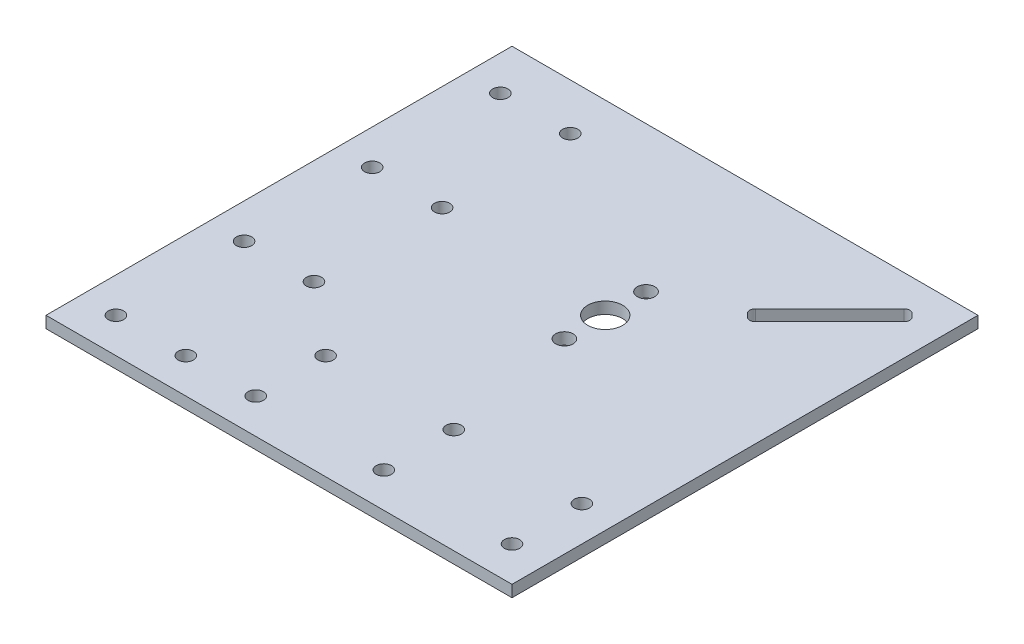
ISO-10303-21;
HEADER;
FILE_DESCRIPTION(('STEP AP214'),'2;1');
FILE_NAME('part.step','',(''),(''),'','','');
FILE_SCHEMA(('AUTOMOTIVE_DESIGN { 1 0 10303 214 1 1 1 1 }'));
ENDSEC;
DATA;
#1=APPLICATION_CONTEXT('core data for automotive mechanical design processes');
#2=APPLICATION_PROTOCOL_DEFINITION('international standard','automotive_design',2000,#1);
#3=PRODUCT_CONTEXT('',#1,'mechanical');
#4=PRODUCT('Part','Part','',(#3));
#5=PRODUCT_RELATED_PRODUCT_CATEGORY('part','',(#4));
#6=PRODUCT_DEFINITION_FORMATION('','',#4);
#7=PRODUCT_DEFINITION_CONTEXT('part definition',#1,'design');
#8=PRODUCT_DEFINITION('design','',#6,#7);
#9=PRODUCT_DEFINITION_SHAPE('','',#8);
#10=(LENGTH_UNIT() NAMED_UNIT(*) SI_UNIT(.MILLI.,.METRE.));
#11=(NAMED_UNIT(*) PLANE_ANGLE_UNIT() SI_UNIT($,.RADIAN.));
#12=(NAMED_UNIT(*) SI_UNIT($,.STERADIAN.) SOLID_ANGLE_UNIT());
#13=UNCERTAINTY_MEASURE_WITH_UNIT(LENGTH_MEASURE(1.E-05),#10,'distance_accuracy_value','');
#14=(GEOMETRIC_REPRESENTATION_CONTEXT(3) GLOBAL_UNCERTAINTY_ASSIGNED_CONTEXT((#13)) GLOBAL_UNIT_ASSIGNED_CONTEXT((#10,
#11,#12)) REPRESENTATION_CONTEXT('',''));
#15=CARTESIAN_POINT('',(0.,0.,0.));
#16=DIRECTION('',(0.,0.,1.));
#17=DIRECTION('',(1.,0.,0.));
#18=AXIS2_PLACEMENT_3D('',#15,#16,#17);
#19=CARTESIAN_POINT('',(95.25,6.35,-57.15));
#20=DIRECTION('',(0.,1.,0.));
#21=DIRECTION('',(0.,0.,1.));
#22=AXIS2_PLACEMENT_3D('',#19,#20,#21);
#23=CYLINDRICAL_SURFACE('',#22,4.16725100000001);
#24=CARTESIAN_POINT('',(95.25,0.,-57.15));
#25=DIRECTION('',(0.,1.,0.));
#26=DIRECTION('',(0.,0.,1.));
#27=AXIS2_PLACEMENT_3D('',#24,#25,#26);
#28=CIRCLE('',#27,4.16725100000001);
#29=CARTESIAN_POINT('',(95.25,0.,-52.982749));
#30=VERTEX_POINT('',#29);
#31=EDGE_CURVE('E216',#30,#30,#28,.T.);
#32=ORIENTED_EDGE('',*,*,#31,.F.);
#33=EDGE_LOOP('',(#32));
#34=FACE_BOUND('',#33,.T.);
#35=CARTESIAN_POINT('',(95.25,6.35,-57.15));
#36=DIRECTION('',(0.,1.,0.));
#37=DIRECTION('',(0.,0.,1.));
#38=AXIS2_PLACEMENT_3D('',#35,#36,#37);
#39=CIRCLE('',#38,4.16725100000001);
#40=CARTESIAN_POINT('',(95.25,6.35,-52.982749));
#41=VERTEX_POINT('',#40);
#42=EDGE_CURVE('E219',#41,#41,#39,.T.);
#43=ORIENTED_EDGE('',*,*,#42,.T.);
#44=EDGE_LOOP('',(#43));
#45=FACE_BOUND('',#44,.T.);
#46=ADVANCED_FACE('F41',(#34,#45),#23,.F.);
#47=CARTESIAN_POINT('',(95.25,6.35,-19.05));
#48=DIRECTION('',(0.,1.,0.));
#49=DIRECTION('',(0.,0.,1.));
#50=AXIS2_PLACEMENT_3D('',#47,#48,#49);
#51=CYLINDRICAL_SURFACE('',#50,4.16725100000001);
#52=CARTESIAN_POINT('',(95.25,0.,-19.05));
#53=DIRECTION('',(0.,1.,0.));
#54=DIRECTION('',(0.,0.,1.));
#55=AXIS2_PLACEMENT_3D('',#52,#53,#54);
#56=CIRCLE('',#55,4.16725100000001);
#57=CARTESIAN_POINT('',(95.25,0.,-14.882749));
#58=VERTEX_POINT('',#57);
#59=EDGE_CURVE('E210',#58,#58,#56,.T.);
#60=ORIENTED_EDGE('',*,*,#59,.F.);
#61=EDGE_LOOP('',(#60));
#62=FACE_BOUND('',#61,.T.);
#63=CARTESIAN_POINT('',(95.25,6.35,-19.05));
#64=DIRECTION('',(0.,1.,0.));
#65=DIRECTION('',(0.,0.,1.));
#66=AXIS2_PLACEMENT_3D('',#63,#64,#65);
#67=CIRCLE('',#66,4.16725100000001);
#68=CARTESIAN_POINT('',(95.25,6.35,-14.882749));
#69=VERTEX_POINT('',#68);
#70=EDGE_CURVE('E213',#69,#69,#67,.T.);
#71=ORIENTED_EDGE('',*,*,#70,.T.);
#72=EDGE_LOOP('',(#71));
#73=FACE_BOUND('',#72,.T.);
#74=ADVANCED_FACE('F358',(#62,#73),#51,.F.);
#75=CARTESIAN_POINT('',(165.1,6.35,-57.15));
#76=DIRECTION('',(0.,1.,0.));
#77=DIRECTION('',(0.,0.,1.));
#78=AXIS2_PLACEMENT_3D('',#75,#76,#77);
#79=CYLINDRICAL_SURFACE('',#78,4.16725100000001);
#80=CARTESIAN_POINT('',(165.1,0.,-57.15));
#81=DIRECTION('',(0.,1.,0.));
#82=DIRECTION('',(0.,0.,1.));
#83=AXIS2_PLACEMENT_3D('',#80,#81,#82);
#84=CIRCLE('',#83,4.16725100000001);
#85=CARTESIAN_POINT('',(165.1,0.,-52.982749));
#86=VERTEX_POINT('',#85);
#87=EDGE_CURVE('E204',#86,#86,#84,.T.);
#88=ORIENTED_EDGE('',*,*,#87,.F.);
#89=EDGE_LOOP('',(#88));
#90=FACE_BOUND('',#89,.T.);
#91=CARTESIAN_POINT('',(165.1,6.35,-57.15));
#92=DIRECTION('',(0.,1.,0.));
#93=DIRECTION('',(0.,0.,1.));
#94=AXIS2_PLACEMENT_3D('',#91,#92,#93);
#95=CIRCLE('',#94,4.16725100000001);
#96=CARTESIAN_POINT('',(165.1,6.35,-52.982749));
#97=VERTEX_POINT('',#96);
#98=EDGE_CURVE('E207',#97,#97,#95,.T.);
#99=ORIENTED_EDGE('',*,*,#98,.T.);
#100=EDGE_LOOP('',(#99));
#101=FACE_BOUND('',#100,.T.);
#102=ADVANCED_FACE('F365',(#90,#101),#79,.F.);
#103=CARTESIAN_POINT('',(165.1,6.35,-19.05));
#104=DIRECTION('',(0.,1.,0.));
#105=DIRECTION('',(0.,0.,1.));
#106=AXIS2_PLACEMENT_3D('',#103,#104,#105);
#107=CYLINDRICAL_SURFACE('',#106,4.16725100000001);
#108=CARTESIAN_POINT('',(165.1,0.,-19.05));
#109=DIRECTION('',(0.,1.,0.));
#110=DIRECTION('',(0.,0.,1.));
#111=AXIS2_PLACEMENT_3D('',#108,#109,#110);
#112=CIRCLE('',#111,4.16725100000001);
#113=CARTESIAN_POINT('',(165.1,0.,-14.882749));
#114=VERTEX_POINT('',#113);
#115=EDGE_CURVE('E198',#114,#114,#112,.T.);
#116=ORIENTED_EDGE('',*,*,#115,.F.);
#117=EDGE_LOOP('',(#116));
#118=FACE_BOUND('',#117,.T.);
#119=CARTESIAN_POINT('',(165.1,6.35,-19.05));
#120=DIRECTION('',(0.,1.,0.));
#121=DIRECTION('',(0.,0.,1.));
#122=AXIS2_PLACEMENT_3D('',#119,#120,#121);
#123=CIRCLE('',#122,4.16725100000001);
#124=CARTESIAN_POINT('',(165.1,6.35,-14.882749));
#125=VERTEX_POINT('',#124);
#126=EDGE_CURVE('E201',#125,#125,#123,.T.);
#127=ORIENTED_EDGE('',*,*,#126,.T.);
#128=EDGE_LOOP('',(#127));
#129=FACE_BOUND('',#128,.T.);
#130=ADVANCED_FACE('F456',(#118,#129),#107,.F.);
#131=CARTESIAN_POINT('',(57.15,6.35,-228.6));
#132=DIRECTION('',(0.,1.,0.));
#133=DIRECTION('',(0.,0.,1.));
#134=AXIS2_PLACEMENT_3D('',#131,#132,#133);
#135=CYLINDRICAL_SURFACE('',#134,4.167251);
#136=CARTESIAN_POINT('',(57.15,0.,-228.6));
#137=DIRECTION('',(0.,1.,0.));
#138=DIRECTION('',(0.,0.,1.));
#139=AXIS2_PLACEMENT_3D('',#136,#137,#138);
#140=CIRCLE('',#139,4.167251);
#141=CARTESIAN_POINT('',(57.15,0.,-224.432749));
#142=VERTEX_POINT('',#141);
#143=EDGE_CURVE('E192',#142,#142,#140,.T.);
#144=ORIENTED_EDGE('',*,*,#143,.F.);
#145=EDGE_LOOP('',(#144));
#146=FACE_BOUND('',#145,.T.);
#147=CARTESIAN_POINT('',(57.15,6.35,-228.6));
#148=DIRECTION('',(0.,1.,0.));
#149=DIRECTION('',(0.,0.,1.));
#150=AXIS2_PLACEMENT_3D('',#147,#148,#149);
#151=CIRCLE('',#150,4.167251);
#152=CARTESIAN_POINT('',(57.15,6.35,-224.432749));
#153=VERTEX_POINT('',#152);
#154=EDGE_CURVE('E195',#153,#153,#151,.T.);
#155=ORIENTED_EDGE('',*,*,#154,.T.);
#156=EDGE_LOOP('',(#155));
#157=FACE_BOUND('',#156,.T.);
#158=ADVANCED_FACE('F459',(#146,#157),#135,.F.);
#159=CARTESIAN_POINT('',(19.05,6.35,-228.6));
#160=DIRECTION('',(0.,1.,0.));
#161=DIRECTION('',(0.,0.,1.));
#162=AXIS2_PLACEMENT_3D('',#159,#160,#161);
#163=CYLINDRICAL_SURFACE('',#162,4.167251);
#164=CARTESIAN_POINT('',(19.05,0.,-228.6));
#165=DIRECTION('',(0.,1.,0.));
#166=DIRECTION('',(0.,0.,1.));
#167=AXIS2_PLACEMENT_3D('',#164,#165,#166);
#168=CIRCLE('',#167,4.167251);
#169=CARTESIAN_POINT('',(19.05,0.,-224.432749));
#170=VERTEX_POINT('',#169);
#171=EDGE_CURVE('E186',#170,#170,#168,.T.);
#172=ORIENTED_EDGE('',*,*,#171,.F.);
#173=EDGE_LOOP('',(#172));
#174=FACE_BOUND('',#173,.T.);
#175=CARTESIAN_POINT('',(19.05,6.35,-228.6));
#176=DIRECTION('',(0.,1.,0.));
#177=DIRECTION('',(0.,0.,1.));
#178=AXIS2_PLACEMENT_3D('',#175,#176,#177);
#179=CIRCLE('',#178,4.167251);
#180=CARTESIAN_POINT('',(19.05,6.35,-224.432749));
#181=VERTEX_POINT('',#180);
#182=EDGE_CURVE('E189',#181,#181,#179,.T.);
#183=ORIENTED_EDGE('',*,*,#182,.T.);
#184=EDGE_LOOP('',(#183));
#185=FACE_BOUND('',#184,.T.);
#186=ADVANCED_FACE('F512',(#174,#185),#163,.F.);
#187=CARTESIAN_POINT('',(57.15,6.35,-158.75));
#188=DIRECTION('',(0.,1.,0.));
#189=DIRECTION('',(0.,0.,1.));
#190=AXIS2_PLACEMENT_3D('',#187,#188,#189);
#191=CYLINDRICAL_SURFACE('',#190,4.167251);
#192=CARTESIAN_POINT('',(57.15,0.,-158.75));
#193=DIRECTION('',(0.,1.,0.));
#194=DIRECTION('',(0.,0.,1.));
#195=AXIS2_PLACEMENT_3D('',#192,#193,#194);
#196=CIRCLE('',#195,4.167251);
#197=CARTESIAN_POINT('',(57.15,0.,-154.582749));
#198=VERTEX_POINT('',#197);
#199=EDGE_CURVE('E180',#198,#198,#196,.T.);
#200=ORIENTED_EDGE('',*,*,#199,.F.);
#201=EDGE_LOOP('',(#200));
#202=FACE_BOUND('',#201,.T.);
#203=CARTESIAN_POINT('',(57.15,6.35,-158.75));
#204=DIRECTION('',(0.,1.,0.));
#205=DIRECTION('',(0.,0.,1.));
#206=AXIS2_PLACEMENT_3D('',#203,#204,#205);
#207=CIRCLE('',#206,4.167251);
#208=CARTESIAN_POINT('',(57.15,6.35,-154.582749));
#209=VERTEX_POINT('',#208);
#210=EDGE_CURVE('E183',#209,#209,#207,.T.);
#211=ORIENTED_EDGE('',*,*,#210,.T.);
#212=EDGE_LOOP('',(#211));
#213=FACE_BOUND('',#212,.T.);
#214=ADVANCED_FACE('F504',(#202,#213),#191,.F.);
#215=CARTESIAN_POINT('',(19.05,6.35,-158.75));
#216=DIRECTION('',(0.,1.,0.));
#217=DIRECTION('',(0.,0.,1.));
#218=AXIS2_PLACEMENT_3D('',#215,#216,#217);
#219=CYLINDRICAL_SURFACE('',#218,4.167251);
#220=CARTESIAN_POINT('',(19.05,0.,-158.75));
#221=DIRECTION('',(0.,1.,0.));
#222=DIRECTION('',(0.,0.,1.));
#223=AXIS2_PLACEMENT_3D('',#220,#221,#222);
#224=CIRCLE('',#223,4.167251);
#225=CARTESIAN_POINT('',(19.05,0.,-154.582749));
#226=VERTEX_POINT('',#225);
#227=EDGE_CURVE('E174',#226,#226,#224,.T.);
#228=ORIENTED_EDGE('',*,*,#227,.F.);
#229=EDGE_LOOP('',(#228));
#230=FACE_BOUND('',#229,.T.);
#231=CARTESIAN_POINT('',(19.05,6.35,-158.75));
#232=DIRECTION('',(0.,1.,0.));
#233=DIRECTION('',(0.,0.,1.));
#234=AXIS2_PLACEMENT_3D('',#231,#232,#233);
#235=CIRCLE('',#234,4.167251);
#236=CARTESIAN_POINT('',(19.05,6.35,-154.582749));
#237=VERTEX_POINT('',#236);
#238=EDGE_CURVE('E177',#237,#237,#235,.T.);
#239=ORIENTED_EDGE('',*,*,#238,.T.);
#240=EDGE_LOOP('',(#239));
#241=FACE_BOUND('',#240,.T.);
#242=ADVANCED_FACE('F496',(#230,#241),#219,.F.);
#243=CARTESIAN_POINT('',(57.15,6.35,-88.9));
#244=DIRECTION('',(0.,1.,0.));
#245=DIRECTION('',(0.,0.,1.));
#246=AXIS2_PLACEMENT_3D('',#243,#244,#245);
#247=CYLINDRICAL_SURFACE('',#246,4.167251);
#248=CARTESIAN_POINT('',(57.15,0.,-88.9));
#249=DIRECTION('',(0.,1.,0.));
#250=DIRECTION('',(0.,0.,1.));
#251=AXIS2_PLACEMENT_3D('',#248,#249,#250);
#252=CIRCLE('',#251,4.167251);
#253=CARTESIAN_POINT('',(57.15,0.,-84.732749));
#254=VERTEX_POINT('',#253);
#255=EDGE_CURVE('E168',#254,#254,#252,.T.);
#256=ORIENTED_EDGE('',*,*,#255,.F.);
#257=EDGE_LOOP('',(#256));
#258=FACE_BOUND('',#257,.T.);
#259=CARTESIAN_POINT('',(57.15,6.35,-88.9));
#260=DIRECTION('',(0.,1.,0.));
#261=DIRECTION('',(0.,0.,1.));
#262=AXIS2_PLACEMENT_3D('',#259,#260,#261);
#263=CIRCLE('',#262,4.167251);
#264=CARTESIAN_POINT('',(57.15,6.35,-84.732749));
#265=VERTEX_POINT('',#264);
#266=EDGE_CURVE('E171',#265,#265,#263,.T.);
#267=ORIENTED_EDGE('',*,*,#266,.T.);
#268=EDGE_LOOP('',(#267));
#269=FACE_BOUND('',#268,.T.);
#270=ADVANCED_FACE('F488',(#258,#269),#247,.F.);
#271=CARTESIAN_POINT('',(19.05,6.35,-88.9));
#272=DIRECTION('',(0.,1.,0.));
#273=DIRECTION('',(0.,0.,1.));
#274=AXIS2_PLACEMENT_3D('',#271,#272,#273);
#275=CYLINDRICAL_SURFACE('',#274,4.167251);
#276=CARTESIAN_POINT('',(19.05,0.,-88.9));
#277=DIRECTION('',(0.,1.,0.));
#278=DIRECTION('',(0.,0.,1.));
#279=AXIS2_PLACEMENT_3D('',#276,#277,#278);
#280=CIRCLE('',#279,4.167251);
#281=CARTESIAN_POINT('',(19.05,0.,-84.732749));
#282=VERTEX_POINT('',#281);
#283=EDGE_CURVE('E157',#282,#282,#280,.T.);
#284=ORIENTED_EDGE('',*,*,#283,.F.);
#285=EDGE_LOOP('',(#284));
#286=FACE_BOUND('',#285,.T.);
#287=CARTESIAN_POINT('',(19.05,6.35,-88.9));
#288=DIRECTION('',(0.,1.,0.));
#289=DIRECTION('',(0.,0.,1.));
#290=AXIS2_PLACEMENT_3D('',#287,#288,#289);
#291=CIRCLE('',#290,4.167251);
#292=CARTESIAN_POINT('',(19.05,6.35,-84.732749));
#293=VERTEX_POINT('',#292);
#294=EDGE_CURVE('E160',#293,#293,#291,.T.);
#295=ORIENTED_EDGE('',*,*,#294,.T.);
#296=EDGE_LOOP('',(#295));
#297=FACE_BOUND('',#296,.T.);
#298=ADVANCED_FACE('F438',(#286,#297),#275,.F.);
#299=CARTESIAN_POINT('',(0.,6.35,0.));
#300=DIRECTION('',(0.,-1.,0.));
#301=DIRECTION('',(0.,0.,-1.));
#302=AXIS2_PLACEMENT_3D('',#299,#300,#301);
#303=PLANE('',#302);
#304=DIRECTION('',(0.707106781186548,0.,-0.707106781186548));
#305=VECTOR('',#304,1.);
#306=CARTESIAN_POINT('',(239.092774839025,6.35,-232.986200676698));
#307=LINE('',#306,#305);
#308=CARTESIAN_POINT('',(196.436558263947,6.35,-190.32998410162));
#309=VERTEX_POINT('',#308);
#310=CARTESIAN_POINT('',(236.847710808758,6.35,-230.741136646431));
#311=VERTEX_POINT('',#310);
#312=EDGE_CURVE('E263',#309,#311,#307,.T.);
#313=ORIENTED_EDGE('',*,*,#312,.F.);
#314=CARTESIAN_POINT('',(194.191494233679,6.35,-192.575048131887));
#315=DIRECTION('',(0.,-1.,0.));
#316=DIRECTION('',(0.,0.,-1.));
#317=AXIS2_PLACEMENT_3D('',#314,#315,#316);
#318=CIRCLE('',#317,3.175);
#319=CARTESIAN_POINT('',(191.946430203412,6.35,-190.32998410162));
#320=VERTEX_POINT('',#319);
#321=EDGE_CURVE('E245',#309,#320,#318,.T.);
#322=ORIENTED_EDGE('',*,*,#321,.T.);
#323=DIRECTION('',(0.707106781186543,0.,0.707106781186552));
#324=VECTOR('',#323,1.);
#325=CARTESIAN_POINT('',(194.191494233679,6.35,-188.084920071352));
#326=LINE('',#325,#324);
#327=CARTESIAN_POINT('',(190.32998410162,6.35,-191.946430203412));
#328=VERTEX_POINT('',#327);
#329=EDGE_CURVE('E285',#328,#320,#326,.T.);
#330=ORIENTED_EDGE('',*,*,#329,.F.);
#331=CARTESIAN_POINT('',(192.575048131887,6.35,-194.191494233679));
#332=DIRECTION('',(0.,-1.,0.));
#333=DIRECTION('',(0.,0.,-1.));
#334=AXIS2_PLACEMENT_3D('',#331,#332,#333);
#335=CIRCLE('',#334,3.175);
#336=CARTESIAN_POINT('',(190.32998410162,6.35,-196.436558263947));
#337=VERTEX_POINT('',#336);
#338=EDGE_CURVE('E241',#328,#337,#335,.T.);
#339=ORIENTED_EDGE('',*,*,#338,.T.);
#340=DIRECTION('',(-0.707106781186548,0.,0.707106781186547));
#341=VECTOR('',#340,1.);
#342=CARTESIAN_POINT('',(188.084920071352,6.35,-194.191494233679));
#343=LINE('',#342,#341);
#344=CARTESIAN_POINT('',(230.741136646431,6.35,-236.847710808758));
#345=VERTEX_POINT('',#344);
#346=EDGE_CURVE('E258',#345,#337,#343,.T.);
#347=ORIENTED_EDGE('',*,*,#346,.F.);
#348=CARTESIAN_POINT('',(232.986200676698,6.35,-234.602646778491));
#349=DIRECTION('',(0.,-1.,0.));
#350=DIRECTION('',(0.,0.,-1.));
#351=AXIS2_PLACEMENT_3D('',#348,#349,#350);
#352=CIRCLE('',#351,3.175);
#353=CARTESIAN_POINT('',(235.231264706965,6.35,-236.847710808758));
#354=VERTEX_POINT('',#353);
#355=EDGE_CURVE('E49',#345,#354,#352,.T.);
#356=ORIENTED_EDGE('',*,*,#355,.T.);
#357=DIRECTION('',(-0.707106781186546,0.,-0.707106781186549));
#358=VECTOR('',#357,1.);
#359=CARTESIAN_POINT('',(232.986200676698,6.35,-239.092774839025));
#360=LINE('',#359,#358);
#361=CARTESIAN_POINT('',(236.847710808758,6.35,-235.231264706965));
#362=VERTEX_POINT('',#361);
#363=EDGE_CURVE('E256',#362,#354,#360,.T.);
#364=ORIENTED_EDGE('',*,*,#363,.F.);
#365=CARTESIAN_POINT('',(234.602646778491,6.35,-232.986200676698));
#366=DIRECTION('',(0.,-1.,0.));
#367=DIRECTION('',(0.,0.,-1.));
#368=AXIS2_PLACEMENT_3D('',#365,#366,#367);
#369=CIRCLE('',#368,3.175);
#370=EDGE_CURVE('E249',#362,#311,#369,.T.);
#371=ORIENTED_EDGE('',*,*,#370,.T.);
#372=EDGE_LOOP('',(#313,#322,#330,#339,#347,#356,#364,#371));
#373=FACE_BOUND('',#372,.T.);
#374=CARTESIAN_POINT('',(234.95,6.35,-57.15));
#375=DIRECTION('',(0.,1.,0.));
#376=DIRECTION('',(0.,0.,1.));
#377=AXIS2_PLACEMENT_3D('',#374,#375,#376);
#378=CIRCLE('',#377,4.16725100000001);
#379=CARTESIAN_POINT('',(234.95,6.35,-52.982749));
#380=VERTEX_POINT('',#379);
#381=EDGE_CURVE('E279',#380,#380,#378,.T.);
#382=ORIENTED_EDGE('',*,*,#381,.F.);
#383=EDGE_LOOP('',(#382));
#384=FACE_BOUND('',#383,.T.);
#385=CARTESIAN_POINT('',(234.95,6.35,-19.05));
#386=DIRECTION('',(0.,1.,0.));
#387=DIRECTION('',(0.,0.,1.));
#388=AXIS2_PLACEMENT_3D('',#385,#386,#387);
#389=CIRCLE('',#388,4.16725100000001);
#390=CARTESIAN_POINT('',(234.95,6.35,-14.882749));
#391=VERTEX_POINT('',#390);
#392=EDGE_CURVE('E294',#391,#391,#389,.T.);
#393=ORIENTED_EDGE('',*,*,#392,.F.);
#394=EDGE_LOOP('',(#393));
#395=FACE_BOUND('',#394,.T.);
#396=CARTESIAN_POINT('',(57.15,6.35,-19.05));
#397=DIRECTION('',(0.,1.,0.));
#398=DIRECTION('',(0.,0.,1.));
#399=AXIS2_PLACEMENT_3D('',#396,#397,#398);
#400=CIRCLE('',#399,4.167251);
#401=CARTESIAN_POINT('',(57.15,6.35,-14.882749));
#402=VERTEX_POINT('',#401);
#403=EDGE_CURVE('E303',#402,#402,#400,.T.);
#404=ORIENTED_EDGE('',*,*,#403,.F.);
#405=EDGE_LOOP('',(#404));
#406=FACE_BOUND('',#405,.T.);
#407=CARTESIAN_POINT('',(19.05,6.35,-19.05));
#408=DIRECTION('',(0.,1.,0.));
#409=DIRECTION('',(0.,0.,1.));
#410=AXIS2_PLACEMENT_3D('',#407,#408,#409);
#411=CIRCLE('',#410,4.167251);
#412=CARTESIAN_POINT('',(19.05,6.35,-14.882749));
#413=VERTEX_POINT('',#412);
#414=EDGE_CURVE('E306',#413,#413,#411,.T.);
#415=ORIENTED_EDGE('',*,*,#414,.F.);
#416=EDGE_LOOP('',(#415));
#417=FACE_BOUND('',#416,.T.);
#418=CARTESIAN_POINT('',(152.4,6.35,-174.6504));
#419=DIRECTION('',(0.,1.,0.));
#420=DIRECTION('',(0.,0.,1.));
#421=AXIS2_PLACEMENT_3D('',#418,#419,#420);
#422=CIRCLE('',#421,4.7625);
#423=CARTESIAN_POINT('',(152.4,6.35,-169.8879));
#424=VERTEX_POINT('',#423);
#425=EDGE_CURVE('E312',#424,#424,#422,.T.);
#426=ORIENTED_EDGE('',*,*,#425,.F.);
#427=EDGE_LOOP('',(#426));
#428=FACE_BOUND('',#427,.T.);
#429=DIRECTION('',(0.,0.,1.));
#430=VECTOR('',#429,1.);
#431=CARTESIAN_POINT('',(0.,6.35,0.));
#432=LINE('',#431,#430);
#433=CARTESIAN_POINT('',(0.,6.35,-254.));
#434=VERTEX_POINT('',#433);
#435=CARTESIAN_POINT('',(0.,6.35,0.));
#436=VERTEX_POINT('',#435);
#437=EDGE_CURVE('E142',#434,#436,#432,.T.);
#438=ORIENTED_EDGE('',*,*,#437,.T.);
#439=DIRECTION('',(1.,0.,0.));
#440=VECTOR('',#439,1.);
#441=CARTESIAN_POINT('',(0.,6.35,0.));
#442=LINE('',#441,#440);
#443=CARTESIAN_POINT('',(254.,6.35,0.));
#444=VERTEX_POINT('',#443);
#445=EDGE_CURVE('E131',#436,#444,#442,.T.);
#446=ORIENTED_EDGE('',*,*,#445,.T.);
#447=DIRECTION('',(0.,0.,-1.));
#448=VECTOR('',#447,1.);
#449=CARTESIAN_POINT('',(254.,6.35,0.));
#450=LINE('',#449,#448);
#451=CARTESIAN_POINT('',(254.,6.35,-254.));
#452=VERTEX_POINT('',#451);
#453=EDGE_CURVE('E141',#444,#452,#450,.T.);
#454=ORIENTED_EDGE('',*,*,#453,.T.);
#455=DIRECTION('',(-1.,0.,0.));
#456=VECTOR('',#455,1.);
#457=CARTESIAN_POINT('',(0.,6.35,-254.));
#458=LINE('',#457,#456);
#459=EDGE_CURVE('E148',#452,#434,#458,.T.);
#460=ORIENTED_EDGE('',*,*,#459,.T.);
#461=EDGE_LOOP('',(#438,#446,#454,#460));
#462=FACE_BOUND('',#461,.T.);
#463=CARTESIAN_POINT('',(152.4,6.35,-152.4));
#464=DIRECTION('',(0.,1.,0.));
#465=DIRECTION('',(0.,0.,1.));
#466=AXIS2_PLACEMENT_3D('',#463,#464,#465);
#467=CIRCLE('',#466,9.52500000000001);
#468=CARTESIAN_POINT('',(152.4,6.35,-142.875));
#469=VERTEX_POINT('',#468);
#470=EDGE_CURVE('E324',#469,#469,#467,.T.);
#471=ORIENTED_EDGE('',*,*,#470,.F.);
#472=EDGE_LOOP('',(#471));
#473=FACE_BOUND('',#472,.T.);
#474=CARTESIAN_POINT('',(152.4,6.35,-130.1496));
#475=DIRECTION('',(0.,1.,0.));
#476=DIRECTION('',(0.,0.,1.));
#477=AXIS2_PLACEMENT_3D('',#474,#475,#476);
#478=CIRCLE('',#477,4.7625);
#479=CARTESIAN_POINT('',(152.4,6.35,-125.3871));
#480=VERTEX_POINT('',#479);
#481=EDGE_CURVE('E318',#480,#480,#478,.T.);
#482=ORIENTED_EDGE('',*,*,#481,.F.);
#483=EDGE_LOOP('',(#482));
#484=FACE_BOUND('',#483,.T.);
#485=ORIENTED_EDGE('',*,*,#294,.F.);
#486=EDGE_LOOP('',(#485));
#487=FACE_BOUND('',#486,.T.);
#488=ORIENTED_EDGE('',*,*,#266,.F.);
#489=EDGE_LOOP('',(#488));
#490=FACE_BOUND('',#489,.T.);
#491=ORIENTED_EDGE('',*,*,#238,.F.);
#492=EDGE_LOOP('',(#491));
#493=FACE_BOUND('',#492,.T.);
#494=ORIENTED_EDGE('',*,*,#210,.F.);
#495=EDGE_LOOP('',(#494));
#496=FACE_BOUND('',#495,.T.);
#497=ORIENTED_EDGE('',*,*,#182,.F.);
#498=EDGE_LOOP('',(#497));
#499=FACE_BOUND('',#498,.T.);
#500=ORIENTED_EDGE('',*,*,#154,.F.);
#501=EDGE_LOOP('',(#500));
#502=FACE_BOUND('',#501,.T.);
#503=ORIENTED_EDGE('',*,*,#126,.F.);
#504=EDGE_LOOP('',(#503));
#505=FACE_BOUND('',#504,.T.);
#506=ORIENTED_EDGE('',*,*,#98,.F.);
#507=EDGE_LOOP('',(#506));
#508=FACE_BOUND('',#507,.T.);
#509=ORIENTED_EDGE('',*,*,#70,.F.);
#510=EDGE_LOOP('',(#509));
#511=FACE_BOUND('',#510,.T.);
#512=ORIENTED_EDGE('',*,*,#42,.F.);
#513=EDGE_LOOP('',(#512));
#514=FACE_BOUND('',#513,.T.);
#515=ADVANCED_FACE('F145',(#373,#384,#395,#406,#417,#428,#462,#473,#484,#487,#490,#493,#496,
#499,#502,#505,#508,#511,#514),#303,.F.);
#516=CARTESIAN_POINT('',(0.,6.35,0.));
#517=DIRECTION('',(1.,0.,0.));
#518=DIRECTION('',(0.,0.,-1.));
#519=AXIS2_PLACEMENT_3D('',#516,#517,#518);
#520=PLANE('',#519);
#521=DIRECTION('',(0.,0.,1.));
#522=VECTOR('',#521,1.);
#523=CARTESIAN_POINT('',(0.,0.,0.));
#524=LINE('',#523,#522);
#525=CARTESIAN_POINT('',(0.,0.,-254.));
#526=VERTEX_POINT('',#525);
#527=CARTESIAN_POINT('',(0.,0.,0.));
#528=VERTEX_POINT('',#527);
#529=EDGE_CURVE('E156',#526,#528,#524,.T.);
#530=ORIENTED_EDGE('',*,*,#529,.T.);
#531=DIRECTION('',(0.,-1.,0.));
#532=VECTOR('',#531,1.);
#533=CARTESIAN_POINT('',(0.,6.35,0.));
#534=LINE('',#533,#532);
#535=EDGE_CURVE('E135',#436,#528,#534,.T.);
#536=ORIENTED_EDGE('',*,*,#535,.F.);
#537=ORIENTED_EDGE('',*,*,#437,.F.);
#538=DIRECTION('',(0.,-1.,0.));
#539=VECTOR('',#538,1.);
#540=CARTESIAN_POINT('',(0.,6.35,-254.));
#541=LINE('',#540,#539);
#542=EDGE_CURVE('E332',#434,#526,#541,.T.);
#543=ORIENTED_EDGE('',*,*,#542,.T.);
#544=EDGE_LOOP('',(#530,#536,#537,#543));
#545=FACE_BOUND('',#544,.T.);
#546=ADVANCED_FACE('F154',(#545),#520,.F.);
#547=CARTESIAN_POINT('',(0.,6.35,0.));
#548=DIRECTION('',(0.,0.,-1.));
#549=DIRECTION('',(-1.,0.,0.));
#550=AXIS2_PLACEMENT_3D('',#547,#548,#549);
#551=PLANE('',#550);
#552=DIRECTION('',(1.,0.,0.));
#553=VECTOR('',#552,1.);
#554=CARTESIAN_POINT('',(0.,0.,0.));
#555=LINE('',#554,#553);
#556=CARTESIAN_POINT('',(254.,0.,0.));
#557=VERTEX_POINT('',#556);
#558=EDGE_CURVE('E334',#528,#557,#555,.T.);
#559=ORIENTED_EDGE('',*,*,#558,.T.);
#560=DIRECTION('',(0.,-1.,0.));
#561=VECTOR('',#560,1.);
#562=CARTESIAN_POINT('',(254.,6.35,0.));
#563=LINE('',#562,#561);
#564=EDGE_CURVE('E138',#444,#557,#563,.T.);
#565=ORIENTED_EDGE('',*,*,#564,.F.);
#566=ORIENTED_EDGE('',*,*,#445,.F.);
#567=ORIENTED_EDGE('',*,*,#535,.T.);
#568=EDGE_LOOP('',(#559,#565,#566,#567));
#569=FACE_BOUND('',#568,.T.);
#570=ADVANCED_FACE('F133',(#569),#551,.F.);
#571=CARTESIAN_POINT('',(254.,6.35,0.));
#572=DIRECTION('',(-1.,0.,0.));
#573=DIRECTION('',(0.,0.,1.));
#574=AXIS2_PLACEMENT_3D('',#571,#572,#573);
#575=PLANE('',#574);
#576=DIRECTION('',(0.,0.,-1.));
#577=VECTOR('',#576,1.);
#578=CARTESIAN_POINT('',(254.,0.,0.));
#579=LINE('',#578,#577);
#580=CARTESIAN_POINT('',(254.,0.,-254.));
#581=VERTEX_POINT('',#580);
#582=EDGE_CURVE('E336',#557,#581,#579,.T.);
#583=ORIENTED_EDGE('',*,*,#582,.T.);
#584=DIRECTION('',(0.,-1.,0.));
#585=VECTOR('',#584,1.);
#586=CARTESIAN_POINT('',(254.,6.35,-254.));
#587=LINE('',#586,#585);
#588=EDGE_CURVE('E162',#452,#581,#587,.T.);
#589=ORIENTED_EDGE('',*,*,#588,.F.);
#590=ORIENTED_EDGE('',*,*,#453,.F.);
#591=ORIENTED_EDGE('',*,*,#564,.T.);
#592=EDGE_LOOP('',(#583,#589,#590,#591));
#593=FACE_BOUND('',#592,.T.);
#594=ADVANCED_FACE('F348',(#593),#575,.F.);
#595=CARTESIAN_POINT('',(0.,6.35,-254.));
#596=DIRECTION('',(0.,0.,1.));
#597=DIRECTION('',(1.,0.,0.));
#598=AXIS2_PLACEMENT_3D('',#595,#596,#597);
#599=PLANE('',#598);
#600=DIRECTION('',(-1.,0.,0.));
#601=VECTOR('',#600,1.);
#602=CARTESIAN_POINT('',(0.,0.,-254.));
#603=LINE('',#602,#601);
#604=EDGE_CURVE('E152',#581,#526,#603,.T.);
#605=ORIENTED_EDGE('',*,*,#604,.T.);
#606=ORIENTED_EDGE('',*,*,#542,.F.);
#607=ORIENTED_EDGE('',*,*,#459,.F.);
#608=ORIENTED_EDGE('',*,*,#588,.T.);
#609=EDGE_LOOP('',(#605,#606,#607,#608));
#610=FACE_BOUND('',#609,.T.);
#611=ADVANCED_FACE('F343',(#610),#599,.F.);
#612=CARTESIAN_POINT('',(0.,0.,0.));
#613=DIRECTION('',(0.,-1.,0.));
#614=DIRECTION('',(0.,0.,-1.));
#615=AXIS2_PLACEMENT_3D('',#612,#613,#614);
#616=PLANE('',#615);
#617=DIRECTION('',(-0.707106781186548,0.,0.707106781186547));
#618=VECTOR('',#617,1.);
#619=CARTESIAN_POINT('',(188.084920071352,0.,-194.191494233679));
#620=LINE('',#619,#618);
#621=CARTESIAN_POINT('',(230.741136646431,0.,-236.847710808758));
#622=VERTEX_POINT('',#621);
#623=CARTESIAN_POINT('',(190.32998410162,0.,-196.436558263947));
#624=VERTEX_POINT('',#623);
#625=EDGE_CURVE('E270',#622,#624,#620,.T.);
#626=ORIENTED_EDGE('',*,*,#625,.T.);
#627=CARTESIAN_POINT('',(192.575048131887,0.,-194.191494233679));
#628=DIRECTION('',(0.,-1.,0.));
#629=DIRECTION('',(0.,0.,-1.));
#630=AXIS2_PLACEMENT_3D('',#627,#628,#629);
#631=CIRCLE('',#630,3.175);
#632=CARTESIAN_POINT('',(190.32998410162,0.,-191.946430203412));
#633=VERTEX_POINT('',#632);
#634=EDGE_CURVE('E243',#624,#633,#631,.F.);
#635=ORIENTED_EDGE('',*,*,#634,.T.);
#636=DIRECTION('',(0.707106781186543,0.,0.707106781186552));
#637=VECTOR('',#636,1.);
#638=CARTESIAN_POINT('',(194.191494233679,0.,-188.084920071352));
#639=LINE('',#638,#637);
#640=CARTESIAN_POINT('',(191.946430203412,0.,-190.32998410162));
#641=VERTEX_POINT('',#640);
#642=EDGE_CURVE('E290',#633,#641,#639,.T.);
#643=ORIENTED_EDGE('',*,*,#642,.T.);
#644=CARTESIAN_POINT('',(194.191494233679,0.,-192.575048131887));
#645=DIRECTION('',(0.,-1.,0.));
#646=DIRECTION('',(0.,0.,-1.));
#647=AXIS2_PLACEMENT_3D('',#644,#645,#646);
#648=CIRCLE('',#647,3.175);
#649=CARTESIAN_POINT('',(196.436558263947,0.,-190.32998410162));
#650=VERTEX_POINT('',#649);
#651=EDGE_CURVE('E247',#641,#650,#648,.F.);
#652=ORIENTED_EDGE('',*,*,#651,.T.);
#653=DIRECTION('',(0.707106781186548,0.,-0.707106781186548));
#654=VECTOR('',#653,1.);
#655=CARTESIAN_POINT('',(239.092774839025,0.,-232.986200676698));
#656=LINE('',#655,#654);
#657=CARTESIAN_POINT('',(236.847710808758,0.,-230.741136646431));
#658=VERTEX_POINT('',#657);
#659=EDGE_CURVE('E281',#650,#658,#656,.T.);
#660=ORIENTED_EDGE('',*,*,#659,.T.);
#661=CARTESIAN_POINT('',(234.602646778491,0.,-232.986200676698));
#662=DIRECTION('',(0.,-1.,0.));
#663=DIRECTION('',(0.,0.,-1.));
#664=AXIS2_PLACEMENT_3D('',#661,#662,#663);
#665=CIRCLE('',#664,3.175);
#666=CARTESIAN_POINT('',(236.847710808758,0.,-235.231264706965));
#667=VERTEX_POINT('',#666);
#668=EDGE_CURVE('E63',#658,#667,#665,.F.);
#669=ORIENTED_EDGE('',*,*,#668,.T.);
#670=DIRECTION('',(-0.707106781186546,0.,-0.707106781186549));
#671=VECTOR('',#670,1.);
#672=CARTESIAN_POINT('',(232.986200676698,0.,-239.092774839025));
#673=LINE('',#672,#671);
#674=CARTESIAN_POINT('',(235.231264706965,0.,-236.847710808758));
#675=VERTEX_POINT('',#674);
#676=EDGE_CURVE('E272',#667,#675,#673,.T.);
#677=ORIENTED_EDGE('',*,*,#676,.T.);
#678=CARTESIAN_POINT('',(232.986200676698,0.,-234.602646778491));
#679=DIRECTION('',(0.,-1.,0.));
#680=DIRECTION('',(0.,0.,-1.));
#681=AXIS2_PLACEMENT_3D('',#678,#679,#680);
#682=CIRCLE('',#681,3.175);
#683=EDGE_CURVE('E11',#675,#622,#682,.F.);
#684=ORIENTED_EDGE('',*,*,#683,.T.);
#685=EDGE_LOOP('',(#626,#635,#643,#652,#660,#669,#677,#684));
#686=FACE_BOUND('',#685,.T.);
#687=CARTESIAN_POINT('',(234.95,0.,-57.15));
#688=DIRECTION('',(0.,1.,0.));
#689=DIRECTION('',(0.,0.,1.));
#690=AXIS2_PLACEMENT_3D('',#687,#688,#689);
#691=CIRCLE('',#690,4.16725100000001);
#692=CARTESIAN_POINT('',(234.95,0.,-52.982749));
#693=VERTEX_POINT('',#692);
#694=EDGE_CURVE('E276',#693,#693,#691,.T.);
#695=ORIENTED_EDGE('',*,*,#694,.T.);
#696=EDGE_LOOP('',(#695));
#697=FACE_BOUND('',#696,.T.);
#698=CARTESIAN_POINT('',(234.95,0.,-19.05));
#699=DIRECTION('',(0.,1.,0.));
#700=DIRECTION('',(0.,0.,1.));
#701=AXIS2_PLACEMENT_3D('',#698,#699,#700);
#702=CIRCLE('',#701,4.16725100000001);
#703=CARTESIAN_POINT('',(234.95,0.,-14.882749));
#704=VERTEX_POINT('',#703);
#705=EDGE_CURVE('E297',#704,#704,#702,.T.);
#706=ORIENTED_EDGE('',*,*,#705,.T.);
#707=EDGE_LOOP('',(#706));
#708=FACE_BOUND('',#707,.T.);
#709=CARTESIAN_POINT('',(57.15,0.,-19.05));
#710=DIRECTION('',(0.,1.,0.));
#711=DIRECTION('',(0.,0.,1.));
#712=AXIS2_PLACEMENT_3D('',#709,#710,#711);
#713=CIRCLE('',#712,4.167251);
#714=CARTESIAN_POINT('',(57.15,0.,-14.882749));
#715=VERTEX_POINT('',#714);
#716=EDGE_CURVE('E300',#715,#715,#713,.T.);
#717=ORIENTED_EDGE('',*,*,#716,.T.);
#718=EDGE_LOOP('',(#717));
#719=FACE_BOUND('',#718,.T.);
#720=CARTESIAN_POINT('',(19.05,0.,-19.05));
#721=DIRECTION('',(0.,1.,0.));
#722=DIRECTION('',(0.,0.,1.));
#723=AXIS2_PLACEMENT_3D('',#720,#721,#722);
#724=CIRCLE('',#723,4.167251);
#725=CARTESIAN_POINT('',(19.05,0.,-14.882749));
#726=VERTEX_POINT('',#725);
#727=EDGE_CURVE('E309',#726,#726,#724,.T.);
#728=ORIENTED_EDGE('',*,*,#727,.T.);
#729=EDGE_LOOP('',(#728));
#730=FACE_BOUND('',#729,.T.);
#731=CARTESIAN_POINT('',(152.4,0.,-174.6504));
#732=DIRECTION('',(0.,-1.,0.));
#733=DIRECTION('',(0.,0.,-1.));
#734=AXIS2_PLACEMENT_3D('',#731,#732,#733);
#735=CIRCLE('',#734,4.7625);
#736=CARTESIAN_POINT('',(152.4,0.,-179.4129));
#737=VERTEX_POINT('',#736);
#738=EDGE_CURVE('E315',#737,#737,#735,.T.);
#739=ORIENTED_EDGE('',*,*,#738,.F.);
#740=EDGE_LOOP('',(#739));
#741=FACE_BOUND('',#740,.T.);
#742=CARTESIAN_POINT('',(152.4,0.,-130.1496));
#743=DIRECTION('',(0.,-1.,0.));
#744=DIRECTION('',(0.,0.,-1.));
#745=AXIS2_PLACEMENT_3D('',#742,#743,#744);
#746=CIRCLE('',#745,4.7625);
#747=CARTESIAN_POINT('',(152.4,0.,-134.9121));
#748=VERTEX_POINT('',#747);
#749=EDGE_CURVE('E321',#748,#748,#746,.T.);
#750=ORIENTED_EDGE('',*,*,#749,.F.);
#751=EDGE_LOOP('',(#750));
#752=FACE_BOUND('',#751,.T.);
#753=CARTESIAN_POINT('',(152.4,0.,-152.4));
#754=DIRECTION('',(0.,-1.,0.));
#755=DIRECTION('',(0.,0.,-1.));
#756=AXIS2_PLACEMENT_3D('',#753,#754,#755);
#757=CIRCLE('',#756,9.52500000000001);
#758=CARTESIAN_POINT('',(152.4,0.,-161.925));
#759=VERTEX_POINT('',#758);
#760=EDGE_CURVE('E327',#759,#759,#757,.T.);
#761=ORIENTED_EDGE('',*,*,#760,.F.);
#762=EDGE_LOOP('',(#761));
#763=FACE_BOUND('',#762,.T.);
#764=ORIENTED_EDGE('',*,*,#529,.F.);
#765=ORIENTED_EDGE('',*,*,#604,.F.);
#766=ORIENTED_EDGE('',*,*,#582,.F.);
#767=ORIENTED_EDGE('',*,*,#558,.F.);
#768=EDGE_LOOP('',(#764,#765,#766,#767));
#769=FACE_BOUND('',#768,.T.);
#770=ORIENTED_EDGE('',*,*,#283,.T.);
#771=EDGE_LOOP('',(#770));
#772=FACE_BOUND('',#771,.T.);
#773=ORIENTED_EDGE('',*,*,#255,.T.);
#774=EDGE_LOOP('',(#773));
#775=FACE_BOUND('',#774,.T.);
#776=ORIENTED_EDGE('',*,*,#227,.T.);
#777=EDGE_LOOP('',(#776));
#778=FACE_BOUND('',#777,.T.);
#779=ORIENTED_EDGE('',*,*,#199,.T.);
#780=EDGE_LOOP('',(#779));
#781=FACE_BOUND('',#780,.T.);
#782=ORIENTED_EDGE('',*,*,#171,.T.);
#783=EDGE_LOOP('',(#782));
#784=FACE_BOUND('',#783,.T.);
#785=ORIENTED_EDGE('',*,*,#143,.T.);
#786=EDGE_LOOP('',(#785));
#787=FACE_BOUND('',#786,.T.);
#788=ORIENTED_EDGE('',*,*,#115,.T.);
#789=EDGE_LOOP('',(#788));
#790=FACE_BOUND('',#789,.T.);
#791=ORIENTED_EDGE('',*,*,#87,.T.);
#792=EDGE_LOOP('',(#791));
#793=FACE_BOUND('',#792,.T.);
#794=ORIENTED_EDGE('',*,*,#59,.T.);
#795=EDGE_LOOP('',(#794));
#796=FACE_BOUND('',#795,.T.);
#797=ORIENTED_EDGE('',*,*,#31,.T.);
#798=EDGE_LOOP('',(#797));
#799=FACE_BOUND('',#798,.T.);
#800=ADVANCED_FACE('F268',(#686,#697,#708,#719,#730,#741,#752,#763,#769,#772,#775,#778,#781,
#784,#787,#790,#793,#796,#799),#616,.T.);
#801=CARTESIAN_POINT('',(152.4,6.35,-152.4));
#802=DIRECTION('',(0.,1.,0.));
#803=DIRECTION('',(0.,0.,1.));
#804=AXIS2_PLACEMENT_3D('',#801,#802,#803);
#805=CYLINDRICAL_SURFACE('',#804,9.52500000000001);
#806=ORIENTED_EDGE('',*,*,#470,.T.);
#807=EDGE_LOOP('',(#806));
#808=FACE_BOUND('',#807,.T.);
#809=ORIENTED_EDGE('',*,*,#760,.T.);
#810=EDGE_LOOP('',(#809));
#811=FACE_BOUND('',#810,.T.);
#812=ADVANCED_FACE('F431',(#808,#811),#805,.F.);
#813=CARTESIAN_POINT('',(152.4,6.35,-130.1496));
#814=DIRECTION('',(0.,1.,0.));
#815=DIRECTION('',(0.,0.,1.));
#816=AXIS2_PLACEMENT_3D('',#813,#814,#815);
#817=CYLINDRICAL_SURFACE('',#816,4.7625);
#818=ORIENTED_EDGE('',*,*,#481,.T.);
#819=EDGE_LOOP('',(#818));
#820=FACE_BOUND('',#819,.T.);
#821=ORIENTED_EDGE('',*,*,#749,.T.);
#822=EDGE_LOOP('',(#821));
#823=FACE_BOUND('',#822,.T.);
#824=ADVANCED_FACE('F427',(#820,#823),#817,.F.);
#825=CARTESIAN_POINT('',(152.4,6.35,-174.6504));
#826=DIRECTION('',(0.,1.,0.));
#827=DIRECTION('',(0.,0.,1.));
#828=AXIS2_PLACEMENT_3D('',#825,#826,#827);
#829=CYLINDRICAL_SURFACE('',#828,4.7625);
#830=ORIENTED_EDGE('',*,*,#425,.T.);
#831=EDGE_LOOP('',(#830));
#832=FACE_BOUND('',#831,.T.);
#833=ORIENTED_EDGE('',*,*,#738,.T.);
#834=EDGE_LOOP('',(#833));
#835=FACE_BOUND('',#834,.T.);
#836=ADVANCED_FACE('F423',(#832,#835),#829,.F.);
#837=CARTESIAN_POINT('',(19.05,6.35,-19.05));
#838=DIRECTION('',(0.,1.,0.));
#839=DIRECTION('',(0.,0.,1.));
#840=AXIS2_PLACEMENT_3D('',#837,#838,#839);
#841=CYLINDRICAL_SURFACE('',#840,4.167251);
#842=ORIENTED_EDGE('',*,*,#727,.F.);
#843=EDGE_LOOP('',(#842));
#844=FACE_BOUND('',#843,.T.);
#845=ORIENTED_EDGE('',*,*,#414,.T.);
#846=EDGE_LOOP('',(#845));
#847=FACE_BOUND('',#846,.T.);
#848=ADVANCED_FACE('F419',(#844,#847),#841,.F.);
#849=CARTESIAN_POINT('',(57.15,6.35,-19.05));
#850=DIRECTION('',(0.,1.,0.));
#851=DIRECTION('',(0.,0.,1.));
#852=AXIS2_PLACEMENT_3D('',#849,#850,#851);
#853=CYLINDRICAL_SURFACE('',#852,4.167251);
#854=ORIENTED_EDGE('',*,*,#716,.F.);
#855=EDGE_LOOP('',(#854));
#856=FACE_BOUND('',#855,.T.);
#857=ORIENTED_EDGE('',*,*,#403,.T.);
#858=EDGE_LOOP('',(#857));
#859=FACE_BOUND('',#858,.T.);
#860=ADVANCED_FACE('F415',(#856,#859),#853,.F.);
#861=CARTESIAN_POINT('',(234.95,6.35,-19.05));
#862=DIRECTION('',(0.,1.,0.));
#863=DIRECTION('',(0.,0.,1.));
#864=AXIS2_PLACEMENT_3D('',#861,#862,#863);
#865=CYLINDRICAL_SURFACE('',#864,4.16725100000001);
#866=ORIENTED_EDGE('',*,*,#705,.F.);
#867=EDGE_LOOP('',(#866));
#868=FACE_BOUND('',#867,.T.);
#869=ORIENTED_EDGE('',*,*,#392,.T.);
#870=EDGE_LOOP('',(#869));
#871=FACE_BOUND('',#870,.T.);
#872=ADVANCED_FACE('F408',(#868,#871),#865,.F.);
#873=CARTESIAN_POINT('',(234.95,6.35,-57.15));
#874=DIRECTION('',(0.,1.,0.));
#875=DIRECTION('',(0.,0.,1.));
#876=AXIS2_PLACEMENT_3D('',#873,#874,#875);
#877=CYLINDRICAL_SURFACE('',#876,4.16725100000001);
#878=ORIENTED_EDGE('',*,*,#694,.F.);
#879=EDGE_LOOP('',(#878));
#880=FACE_BOUND('',#879,.T.);
#881=ORIENTED_EDGE('',*,*,#381,.T.);
#882=EDGE_LOOP('',(#881));
#883=FACE_BOUND('',#882,.T.);
#884=ADVANCED_FACE('F400',(#880,#883),#877,.F.);
#885=CARTESIAN_POINT('',(194.191494233679,0.,-188.084920071352));
#886=DIRECTION('',(-0.707106781186552,0.,0.707106781186543));
#887=DIRECTION('',(0.707106781186543,0.,0.707106781186552));
#888=AXIS2_PLACEMENT_3D('',#885,#886,#887);
#889=PLANE('',#888);
#890=ORIENTED_EDGE('',*,*,#642,.F.);
#891=DIRECTION('',(0.,1.,0.));
#892=VECTOR('',#891,1.);
#893=CARTESIAN_POINT('',(190.32998410162,6.35,-191.946430203412));
#894=LINE('',#893,#892);
#895=EDGE_CURVE('E224',#633,#328,#894,.T.);
#896=ORIENTED_EDGE('',*,*,#895,.T.);
#897=ORIENTED_EDGE('',*,*,#329,.T.);
#898=DIRECTION('',(0.,1.,0.));
#899=VECTOR('',#898,1.);
#900=CARTESIAN_POINT('',(191.946430203412,0.,-190.32998410162));
#901=LINE('',#900,#899);
#902=EDGE_CURVE('E222',#320,#641,#901,.F.);
#903=ORIENTED_EDGE('',*,*,#902,.T.);
#904=EDGE_LOOP('',(#890,#896,#897,#903));
#905=FACE_BOUND('',#904,.T.);
#906=ADVANCED_FACE('F395',(#905),#889,.F.);
#907=CARTESIAN_POINT('',(188.084920071352,0.,-194.191494233679));
#908=DIRECTION('',(-0.707106781186547,0.,-0.707106781186548));
#909=DIRECTION('',(-0.707106781186548,0.,0.707106781186547));
#910=AXIS2_PLACEMENT_3D('',#907,#908,#909);
#911=PLANE('',#910);
#912=ORIENTED_EDGE('',*,*,#346,.T.);
#913=DIRECTION('',(0.,1.,0.));
#914=VECTOR('',#913,1.);
#915=CARTESIAN_POINT('',(190.32998410162,0.,-196.436558263947));
#916=LINE('',#915,#914);
#917=EDGE_CURVE('E230',#337,#624,#916,.F.);
#918=ORIENTED_EDGE('',*,*,#917,.T.);
#919=ORIENTED_EDGE('',*,*,#625,.F.);
#920=DIRECTION('',(0.,1.,0.));
#921=VECTOR('',#920,1.);
#922=CARTESIAN_POINT('',(230.741136646431,6.35,-236.847710808758));
#923=LINE('',#922,#921);
#924=EDGE_CURVE('E227',#622,#345,#923,.T.);
#925=ORIENTED_EDGE('',*,*,#924,.T.);
#926=EDGE_LOOP('',(#912,#918,#919,#925));
#927=FACE_BOUND('',#926,.T.);
#928=ADVANCED_FACE('F274',(#927),#911,.F.);
#929=CARTESIAN_POINT('',(232.986200676698,0.,-239.092774839025));
#930=DIRECTION('',(0.707106781186549,0.,-0.707106781186546));
#931=DIRECTION('',(-0.707106781186546,0.,-0.707106781186549));
#932=AXIS2_PLACEMENT_3D('',#929,#930,#931);
#933=PLANE('',#932);
#934=ORIENTED_EDGE('',*,*,#676,.F.);
#935=DIRECTION('',(0.,1.,0.));
#936=VECTOR('',#935,1.);
#937=CARTESIAN_POINT('',(236.847710808758,6.35,-235.231264706965));
#938=LINE('',#937,#936);
#939=EDGE_CURVE('E238',#667,#362,#938,.T.);
#940=ORIENTED_EDGE('',*,*,#939,.T.);
#941=ORIENTED_EDGE('',*,*,#363,.T.);
#942=DIRECTION('',(0.,1.,0.));
#943=VECTOR('',#942,1.);
#944=CARTESIAN_POINT('',(235.231264706965,0.,-236.847710808758));
#945=LINE('',#944,#943);
#946=EDGE_CURVE('E56',#354,#675,#945,.F.);
#947=ORIENTED_EDGE('',*,*,#946,.T.);
#948=EDGE_LOOP('',(#934,#940,#941,#947));
#949=FACE_BOUND('',#948,.T.);
#950=ADVANCED_FACE('F261',(#949),#933,.F.);
#951=CARTESIAN_POINT('',(239.092774839025,0.,-232.986200676698));
#952=DIRECTION('',(0.707106781186548,0.,0.707106781186548));
#953=DIRECTION('',(0.707106781186548,0.,-0.707106781186548));
#954=AXIS2_PLACEMENT_3D('',#951,#952,#953);
#955=PLANE('',#954);
#956=ORIENTED_EDGE('',*,*,#659,.F.);
#957=DIRECTION('',(0.,1.,0.));
#958=VECTOR('',#957,1.);
#959=CARTESIAN_POINT('',(196.436558263947,6.35,-190.32998410162));
#960=LINE('',#959,#958);
#961=EDGE_CURVE('E234',#650,#309,#960,.T.);
#962=ORIENTED_EDGE('',*,*,#961,.T.);
#963=ORIENTED_EDGE('',*,*,#312,.T.);
#964=DIRECTION('',(0.,1.,0.));
#965=VECTOR('',#964,1.);
#966=CARTESIAN_POINT('',(236.847710808758,0.,-230.741136646431));
#967=LINE('',#966,#965);
#968=EDGE_CURVE('E232',#311,#658,#967,.F.);
#969=ORIENTED_EDGE('',*,*,#968,.T.);
#970=EDGE_LOOP('',(#956,#962,#963,#969));
#971=FACE_BOUND('',#970,.T.);
#972=ADVANCED_FACE('F376',(#971),#955,.F.);
#973=CARTESIAN_POINT('',(192.575048131887,0.,-194.191494233679));
#974=DIRECTION('',(0.,-1.,0.));
#975=DIRECTION('',(0.,0.,-1.));
#976=AXIS2_PLACEMENT_3D('',#973,#974,#975);
#977=CYLINDRICAL_SURFACE('',#976,3.175);
#978=ORIENTED_EDGE('',*,*,#634,.F.);
#979=ORIENTED_EDGE('',*,*,#917,.F.);
#980=ORIENTED_EDGE('',*,*,#338,.F.);
#981=ORIENTED_EDGE('',*,*,#895,.F.);
#982=EDGE_LOOP('',(#978,#979,#980,#981));
#983=FACE_BOUND('',#982,.T.);
#984=ADVANCED_FACE('F372',(#983),#977,.F.);
#985=CARTESIAN_POINT('',(194.191494233679,0.,-192.575048131887));
#986=DIRECTION('',(0.,-1.,0.));
#987=DIRECTION('',(0.,0.,-1.));
#988=AXIS2_PLACEMENT_3D('',#985,#986,#987);
#989=CYLINDRICAL_SURFACE('',#988,3.175);
#990=ORIENTED_EDGE('',*,*,#651,.F.);
#991=ORIENTED_EDGE('',*,*,#902,.F.);
#992=ORIENTED_EDGE('',*,*,#321,.F.);
#993=ORIENTED_EDGE('',*,*,#961,.F.);
#994=EDGE_LOOP('',(#990,#991,#992,#993));
#995=FACE_BOUND('',#994,.T.);
#996=ADVANCED_FACE('F375',(#995),#989,.F.);
#997=CARTESIAN_POINT('',(234.602646778491,0.,-232.986200676698));
#998=DIRECTION('',(0.,-1.,0.));
#999=DIRECTION('',(0.,0.,-1.));
#1000=AXIS2_PLACEMENT_3D('',#997,#998,#999);
#1001=CYLINDRICAL_SURFACE('',#1000,3.175);
#1002=ORIENTED_EDGE('',*,*,#668,.F.);
#1003=ORIENTED_EDGE('',*,*,#968,.F.);
#1004=ORIENTED_EDGE('',*,*,#370,.F.);
#1005=ORIENTED_EDGE('',*,*,#939,.F.);
#1006=EDGE_LOOP('',(#1002,#1003,#1004,#1005));
#1007=FACE_BOUND('',#1006,.T.);
#1008=ADVANCED_FACE('F379',(#1007),#1001,.F.);
#1009=CARTESIAN_POINT('',(232.986200676698,0.,-234.602646778491));
#1010=DIRECTION('',(0.,-1.,0.));
#1011=DIRECTION('',(0.,0.,-1.));
#1012=AXIS2_PLACEMENT_3D('',#1009,#1010,#1011);
#1013=CYLINDRICAL_SURFACE('',#1012,3.175);
#1014=ORIENTED_EDGE('',*,*,#683,.F.);
#1015=ORIENTED_EDGE('',*,*,#946,.F.);
#1016=ORIENTED_EDGE('',*,*,#355,.F.);
#1017=ORIENTED_EDGE('',*,*,#924,.F.);
#1018=EDGE_LOOP('',(#1014,#1015,#1016,#1017));
#1019=FACE_BOUND('',#1018,.T.);
#1020=ADVANCED_FACE('F43',(#1019),#1013,.F.);
#1021=CLOSED_SHELL('',(#46,#74,#102,#130,#158,#186,#214,#242,#270,#298,#515,#546,#570,#594,#611,
#800,#812,#824,#836,#848,#860,#872,#884,#906,#928,#950,#972,#984,#996,#1008,#1020));
#1022=MANIFOLD_SOLID_BREP('B2',#1021);
#1023=ADVANCED_BREP_SHAPE_REPRESENTATION('',(#18,#1022),#14);
#1024=SHAPE_DEFINITION_REPRESENTATION(#9,#1023);
ENDSEC;
END-ISO-10303-21;
